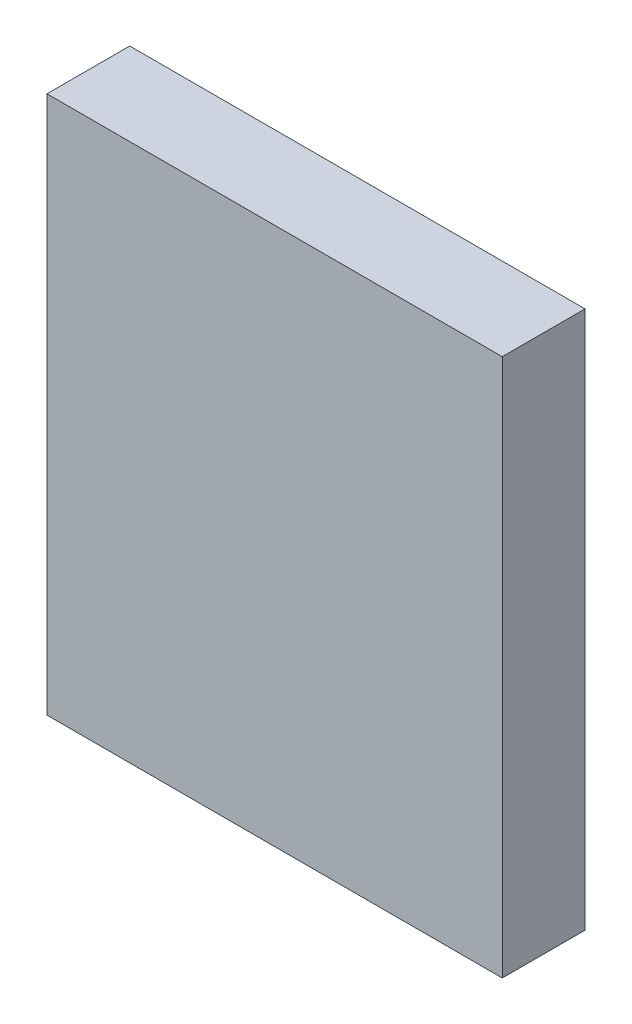
ISO-10303-21;
HEADER;
FILE_DESCRIPTION(('STEP AP214'),'2;1');
FILE_NAME('part.step','',(''),(''),'','','');
FILE_SCHEMA(('AUTOMOTIVE_DESIGN { 1 0 10303 214 1 1 1 1 }'));
ENDSEC;
DATA;
#1=APPLICATION_CONTEXT('core data for automotive mechanical design processes');
#2=APPLICATION_PROTOCOL_DEFINITION('international standard','automotive_design',2000,#1);
#3=PRODUCT_CONTEXT('',#1,'mechanical');
#4=PRODUCT('Part','Part','',(#3));
#5=PRODUCT_RELATED_PRODUCT_CATEGORY('part','',(#4));
#6=PRODUCT_DEFINITION_FORMATION('','',#4);
#7=PRODUCT_DEFINITION_CONTEXT('part definition',#1,'design');
#8=PRODUCT_DEFINITION('design','',#6,#7);
#9=PRODUCT_DEFINITION_SHAPE('','',#8);
#10=(LENGTH_UNIT() NAMED_UNIT(*) SI_UNIT(.MILLI.,.METRE.));
#11=(NAMED_UNIT(*) PLANE_ANGLE_UNIT() SI_UNIT($,.RADIAN.));
#12=(NAMED_UNIT(*) SI_UNIT($,.STERADIAN.) SOLID_ANGLE_UNIT());
#13=UNCERTAINTY_MEASURE_WITH_UNIT(LENGTH_MEASURE(1.E-05),#10,'distance_accuracy_value','');
#14=(GEOMETRIC_REPRESENTATION_CONTEXT(3) GLOBAL_UNCERTAINTY_ASSIGNED_CONTEXT((#13)) GLOBAL_UNIT_ASSIGNED_CONTEXT((#10,
#11,#12)) REPRESENTATION_CONTEXT('',''));
#15=CARTESIAN_POINT('',(0.,0.,0.));
#16=DIRECTION('',(0.,0.,1.));
#17=DIRECTION('',(1.,0.,0.));
#18=AXIS2_PLACEMENT_3D('',#15,#16,#17);
#19=CARTESIAN_POINT('',(34.925,41.275,12.7));
#20=DIRECTION('',(-1.,0.,0.));
#21=DIRECTION('',(0.,-1.,0.));
#22=AXIS2_PLACEMENT_3D('',#19,#20,#21);
#23=PLANE('',#22);
#24=DIRECTION('',(0.,1.,0.));
#25=VECTOR('',#24,1.);
#26=CARTESIAN_POINT('',(34.925,41.275,0.));
#27=LINE('',#26,#25);
#28=CARTESIAN_POINT('',(34.925,-41.275,0.));
#29=VERTEX_POINT('',#28);
#30=CARTESIAN_POINT('',(34.925,41.275,0.));
#31=VERTEX_POINT('',#30);
#32=EDGE_CURVE('E107',#29,#31,#27,.T.);
#33=ORIENTED_EDGE('',*,*,#32,.T.);
#34=DIRECTION('',(0.,0.,-1.));
#35=VECTOR('',#34,1.);
#36=CARTESIAN_POINT('',(34.925,41.275,12.7));
#37=LINE('',#36,#35);
#38=CARTESIAN_POINT('',(34.925,41.275,12.7));
#39=VERTEX_POINT('',#38);
#40=EDGE_CURVE('E11',#39,#31,#37,.T.);
#41=ORIENTED_EDGE('',*,*,#40,.F.);
#42=DIRECTION('',(0.,1.,0.));
#43=VECTOR('',#42,1.);
#44=CARTESIAN_POINT('',(34.925,41.275,12.7));
#45=LINE('',#44,#43);
#46=CARTESIAN_POINT('',(34.925,-41.275,12.7));
#47=VERTEX_POINT('',#46);
#48=EDGE_CURVE('E91',#47,#39,#45,.T.);
#49=ORIENTED_EDGE('',*,*,#48,.F.);
#50=DIRECTION('',(0.,0.,-1.));
#51=VECTOR('',#50,1.);
#52=CARTESIAN_POINT('',(34.925,-41.275,12.7));
#53=LINE('',#52,#51);
#54=EDGE_CURVE('E103',#47,#29,#53,.T.);
#55=ORIENTED_EDGE('',*,*,#54,.T.);
#56=EDGE_LOOP('',(#33,#41,#49,#55));
#57=FACE_BOUND('',#56,.T.);
#58=ADVANCED_FACE('F39',(#57),#23,.F.);
#59=CARTESIAN_POINT('',(-34.925,41.275,12.7));
#60=DIRECTION('',(0.,-1.,0.));
#61=DIRECTION('',(0.,0.,-1.));
#62=AXIS2_PLACEMENT_3D('',#59,#60,#61);
#63=PLANE('',#62);
#64=DIRECTION('',(-1.,0.,0.));
#65=VECTOR('',#64,1.);
#66=CARTESIAN_POINT('',(-34.925,41.275,0.));
#67=LINE('',#66,#65);
#68=CARTESIAN_POINT('',(-34.925,41.275,0.));
#69=VERTEX_POINT('',#68);
#70=EDGE_CURVE('E96',#31,#69,#67,.T.);
#71=ORIENTED_EDGE('',*,*,#70,.T.);
#72=DIRECTION('',(0.,0.,-1.));
#73=VECTOR('',#72,1.);
#74=CARTESIAN_POINT('',(-34.925,41.275,12.7));
#75=LINE('',#74,#73);
#76=CARTESIAN_POINT('',(-34.925,41.275,12.7));
#77=VERTEX_POINT('',#76);
#78=EDGE_CURVE('E48',#77,#69,#75,.T.);
#79=ORIENTED_EDGE('',*,*,#78,.F.);
#80=DIRECTION('',(-1.,0.,0.));
#81=VECTOR('',#80,1.);
#82=CARTESIAN_POINT('',(-34.925,41.275,12.7));
#83=LINE('',#82,#81);
#84=EDGE_CURVE('E86',#39,#77,#83,.T.);
#85=ORIENTED_EDGE('',*,*,#84,.F.);
#86=ORIENTED_EDGE('',*,*,#40,.T.);
#87=EDGE_LOOP('',(#71,#79,#85,#86));
#88=FACE_BOUND('',#87,.T.);
#89=ADVANCED_FACE('F95',(#88),#63,.F.);
#90=CARTESIAN_POINT('',(-34.925,41.275,12.7));
#91=DIRECTION('',(1.,0.,0.));
#92=DIRECTION('',(0.,0.,-1.));
#93=AXIS2_PLACEMENT_3D('',#90,#91,#92);
#94=PLANE('',#93);
#95=DIRECTION('',(0.,-1.,0.));
#96=VECTOR('',#95,1.);
#97=CARTESIAN_POINT('',(-34.925,41.275,0.));
#98=LINE('',#97,#96);
#99=CARTESIAN_POINT('',(-34.925,-41.275,0.));
#100=VERTEX_POINT('',#99);
#101=EDGE_CURVE('E73',#69,#100,#98,.T.);
#102=ORIENTED_EDGE('',*,*,#101,.T.);
#103=DIRECTION('',(0.,0.,-1.));
#104=VECTOR('',#103,1.);
#105=CARTESIAN_POINT('',(-34.925,-41.275,12.7));
#106=LINE('',#105,#104);
#107=CARTESIAN_POINT('',(-34.925,-41.275,12.7));
#108=VERTEX_POINT('',#107);
#109=EDGE_CURVE('E98',#108,#100,#106,.T.);
#110=ORIENTED_EDGE('',*,*,#109,.F.);
#111=DIRECTION('',(0.,-1.,0.));
#112=VECTOR('',#111,1.);
#113=CARTESIAN_POINT('',(-34.925,41.275,12.7));
#114=LINE('',#113,#112);
#115=EDGE_CURVE('E89',#77,#108,#114,.T.);
#116=ORIENTED_EDGE('',*,*,#115,.F.);
#117=ORIENTED_EDGE('',*,*,#78,.T.);
#118=EDGE_LOOP('',(#102,#110,#116,#117));
#119=FACE_BOUND('',#118,.T.);
#120=ADVANCED_FACE('F99',(#119),#94,.F.);
#121=CARTESIAN_POINT('',(-34.925,-41.275,12.7));
#122=DIRECTION('',(0.,1.,0.));
#123=DIRECTION('',(0.,0.,1.));
#124=AXIS2_PLACEMENT_3D('',#121,#122,#123);
#125=PLANE('',#124);
#126=DIRECTION('',(1.,0.,0.));
#127=VECTOR('',#126,1.);
#128=CARTESIAN_POINT('',(-34.925,-41.275,0.));
#129=LINE('',#128,#127);
#130=EDGE_CURVE('E79',#100,#29,#129,.T.);
#131=ORIENTED_EDGE('',*,*,#130,.T.);
#132=ORIENTED_EDGE('',*,*,#54,.F.);
#133=DIRECTION('',(1.,0.,0.));
#134=VECTOR('',#133,1.);
#135=CARTESIAN_POINT('',(-34.925,-41.275,12.7));
#136=LINE('',#135,#134);
#137=EDGE_CURVE('E56',#108,#47,#136,.T.);
#138=ORIENTED_EDGE('',*,*,#137,.F.);
#139=ORIENTED_EDGE('',*,*,#109,.T.);
#140=EDGE_LOOP('',(#131,#132,#138,#139));
#141=FACE_BOUND('',#140,.T.);
#142=ADVANCED_FACE('F120',(#141),#125,.F.);
#143=CARTESIAN_POINT('',(0.,0.,12.7));
#144=DIRECTION('',(0.,0.,1.));
#145=DIRECTION('',(1.,0.,0.));
#146=AXIS2_PLACEMENT_3D('',#143,#144,#145);
#147=PLANE('',#146);
#148=ORIENTED_EDGE('',*,*,#48,.T.);
#149=ORIENTED_EDGE('',*,*,#84,.T.);
#150=ORIENTED_EDGE('',*,*,#115,.T.);
#151=ORIENTED_EDGE('',*,*,#137,.T.);
#152=EDGE_LOOP('',(#148,#149,#150,#151));
#153=FACE_BOUND('',#152,.T.);
#154=ADVANCED_FACE('F87',(#153),#147,.T.);
#155=CARTESIAN_POINT('',(0.,0.,0.));
#156=DIRECTION('',(0.,0.,1.));
#157=DIRECTION('',(1.,0.,0.));
#158=AXIS2_PLACEMENT_3D('',#155,#156,#157);
#159=PLANE('',#158);
#160=ORIENTED_EDGE('',*,*,#32,.F.);
#161=ORIENTED_EDGE('',*,*,#130,.F.);
#162=ORIENTED_EDGE('',*,*,#101,.F.);
#163=ORIENTED_EDGE('',*,*,#70,.F.);
#164=EDGE_LOOP('',(#160,#161,#162,#163));
#165=FACE_BOUND('',#164,.T.);
#166=ADVANCED_FACE('F123',(#165),#159,.F.);
#167=CLOSED_SHELL('',(#58,#89,#120,#142,#154,#166));
#168=MANIFOLD_SOLID_BREP('B2',#167);
#169=ADVANCED_BREP_SHAPE_REPRESENTATION('',(#18,#168),#14);
#170=SHAPE_DEFINITION_REPRESENTATION(#9,#169);
ENDSEC;
END-ISO-10303-21;
